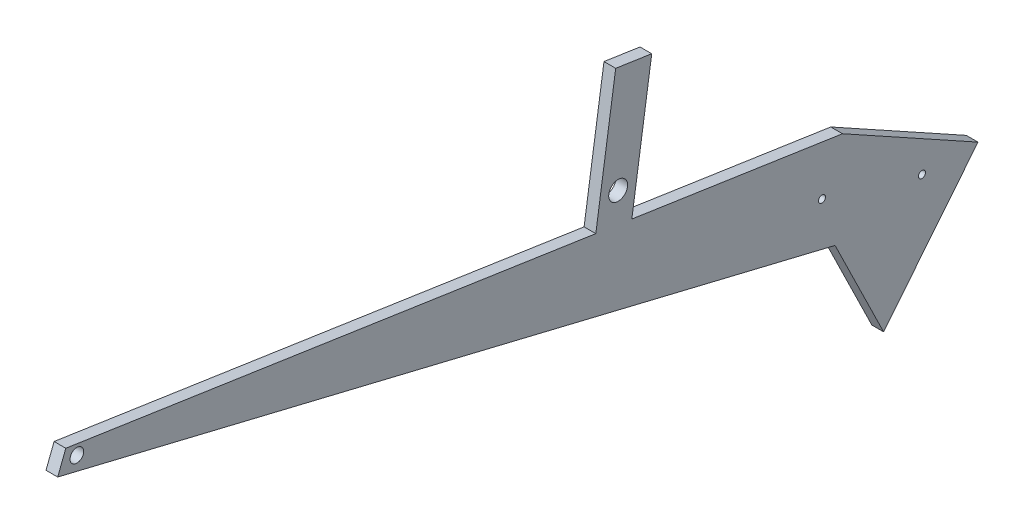
ISO-10303-21;
HEADER;
FILE_DESCRIPTION(('STEP AP214'),'2;1');
FILE_NAME('part.step','',(''),(''),'','','');
FILE_SCHEMA(('AUTOMOTIVE_DESIGN { 1 0 10303 214 1 1 1 1 }'));
ENDSEC;
DATA;
#1=APPLICATION_CONTEXT('core data for automotive mechanical design processes');
#2=APPLICATION_PROTOCOL_DEFINITION('international standard','automotive_design',2000,#1);
#3=PRODUCT_CONTEXT('',#1,'mechanical');
#4=PRODUCT('Part','Part','',(#3));
#5=PRODUCT_RELATED_PRODUCT_CATEGORY('part','',(#4));
#6=PRODUCT_DEFINITION_FORMATION('','',#4);
#7=PRODUCT_DEFINITION_CONTEXT('part definition',#1,'design');
#8=PRODUCT_DEFINITION('design','',#6,#7);
#9=PRODUCT_DEFINITION_SHAPE('','',#8);
#10=(LENGTH_UNIT() NAMED_UNIT(*) SI_UNIT(.MILLI.,.METRE.));
#11=(NAMED_UNIT(*) PLANE_ANGLE_UNIT() SI_UNIT($,.RADIAN.));
#12=(NAMED_UNIT(*) SI_UNIT($,.STERADIAN.) SOLID_ANGLE_UNIT());
#13=UNCERTAINTY_MEASURE_WITH_UNIT(LENGTH_MEASURE(1.E-05),#10,'distance_accuracy_value','');
#14=(GEOMETRIC_REPRESENTATION_CONTEXT(3) GLOBAL_UNCERTAINTY_ASSIGNED_CONTEXT((#13)) GLOBAL_UNIT_ASSIGNED_CONTEXT((#10,
#11,#12)) REPRESENTATION_CONTEXT('',''));
#15=CARTESIAN_POINT('',(0.,0.,0.));
#16=DIRECTION('',(0.,0.,1.));
#17=DIRECTION('',(1.,0.,0.));
#18=AXIS2_PLACEMENT_3D('',#15,#16,#17);
#19=CARTESIAN_POINT('',(2.,8.24424726239253,-1.23091191764888));
#20=DIRECTION('',(0.,0.989036882370752,-0.1476687011873));
#21=DIRECTION('',(0.,0.1476687011873,0.989036882370752));
#22=AXIS2_PLACEMENT_3D('',#19,#20,#21);
#23=PLANE('',#22);
#24=DIRECTION('',(0.,-0.1476687011873,-0.989036882370752));
#25=VECTOR('',#24,1.);
#26=CARTESIAN_POINT('',(0.,8.24424726239253,-1.23091191764888));
#27=LINE('',#26,#25);
#28=CARTESIAN_POINT('',(0.,13.2754290355139,32.4663055395363));
#29=VERTEX_POINT('',#28);
#30=CARTESIAN_POINT('',(0.,7.90579881884249,-3.49772940003051));
#31=VERTEX_POINT('',#30);
#32=EDGE_CURVE('E57',#29,#31,#27,.T.);
#33=ORIENTED_EDGE('',*,*,#32,.F.);
#34=DIRECTION('',(1.,0.,0.));
#35=VECTOR('',#34,1.);
#36=CARTESIAN_POINT('',(0.,13.2754290355139,32.4663055395363));
#37=LINE('',#36,#35);
#38=CARTESIAN_POINT('',(2.,13.2754290355139,32.4663055395363));
#39=VERTEX_POINT('',#38);
#40=EDGE_CURVE('E52',#29,#39,#37,.T.);
#41=ORIENTED_EDGE('',*,*,#40,.T.);
#42=DIRECTION('',(0.,-0.1476687011873,-0.989036882370752));
#43=VECTOR('',#42,1.);
#44=CARTESIAN_POINT('',(2.,8.24424726239253,-1.23091191764888));
#45=LINE('',#44,#43);
#46=CARTESIAN_POINT('',(2.,7.90579881884249,-3.49772940003051));
#47=VERTEX_POINT('',#46);
#48=EDGE_CURVE('E171',#39,#47,#45,.T.);
#49=ORIENTED_EDGE('',*,*,#48,.T.);
#50=DIRECTION('',(-1.,0.,0.));
#51=VECTOR('',#50,1.);
#52=CARTESIAN_POINT('',(2.,7.90579881884249,-3.49772940003051));
#53=LINE('',#52,#51);
#54=EDGE_CURVE('E196',#47,#31,#53,.T.);
#55=ORIENTED_EDGE('',*,*,#54,.T.);
#56=EDGE_LOOP('',(#33,#41,#49,#55));
#57=FACE_BOUND('',#56,.T.);
#58=ADVANCED_FACE('F37',(#57),#23,.T.);
#59=CARTESIAN_POINT('',(2.,47.075809585773,121.612508096581));
#60=DIRECTION('',(0.,0.36099410255771,0.932568098274091));
#61=DIRECTION('',(0.,-0.932568098274091,0.36099410255771));
#62=AXIS2_PLACEMENT_3D('',#59,#60,#61);
#63=PLANE('',#62);
#64=DIRECTION('',(0.,0.932568098274091,-0.36099410255771));
#65=VECTOR('',#64,1.);
#66=CARTESIAN_POINT('',(0.,47.075809585773,121.612508096581));
#67=LINE('',#66,#65);
#68=CARTESIAN_POINT('',(0.,24.1365407268088,130.492225074245));
#69=VERTEX_POINT('',#68);
#70=CARTESIAN_POINT('',(0.,27.7050017136666,129.110885337396));
#71=VERTEX_POINT('',#70);
#72=EDGE_CURVE('E180',#69,#71,#67,.T.);
#73=ORIENTED_EDGE('',*,*,#72,.F.);
#74=DIRECTION('',(-1.,0.,0.));
#75=VECTOR('',#74,1.);
#76=CARTESIAN_POINT('',(2.,24.1365407268088,130.492225074245));
#77=LINE('',#76,#75);
#78=CARTESIAN_POINT('',(2.,24.1365407268088,130.492225074245));
#79=VERTEX_POINT('',#78);
#80=EDGE_CURVE('E11',#79,#69,#77,.T.);
#81=ORIENTED_EDGE('',*,*,#80,.F.);
#82=DIRECTION('',(0.,0.932568098274091,-0.36099410255771));
#83=VECTOR('',#82,1.);
#84=CARTESIAN_POINT('',(2.,47.075809585773,121.612508096581));
#85=LINE('',#84,#83);
#86=CARTESIAN_POINT('',(2.,27.7050017136666,129.110885337396));
#87=VERTEX_POINT('',#86);
#88=EDGE_CURVE('E156',#79,#87,#85,.T.);
#89=ORIENTED_EDGE('',*,*,#88,.T.);
#90=DIRECTION('',(-1.,0.,0.));
#91=VECTOR('',#90,1.);
#92=CARTESIAN_POINT('',(2.,27.7050017136666,129.110885337396));
#93=LINE('',#92,#91);
#94=EDGE_CURVE('E173',#87,#71,#93,.T.);
#95=ORIENTED_EDGE('',*,*,#94,.T.);
#96=EDGE_LOOP('',(#73,#81,#89,#95));
#97=FACE_BOUND('',#96,.T.);
#98=ADVANCED_FACE('F221',(#97),#63,.T.);
#99=CARTESIAN_POINT('',(2.,-7.02811720474141,1.70064588041878));
#100=DIRECTION('',(0.,-0.971949450634516,0.235189849719887));
#101=DIRECTION('',(0.,-0.235189849719887,-0.971949450634516));
#102=AXIS2_PLACEMENT_3D('',#99,#100,#101);
#103=PLANE('',#102);
#104=DIRECTION('',(0.,0.235189849719887,0.971949450634516));
#105=VECTOR('',#104,1.);
#106=CARTESIAN_POINT('',(0.,-7.02811720474141,1.70064588041878));
#107=LINE('',#106,#105);
#108=CARTESIAN_POINT('',(0.,-7.97960815491177,-2.23150130791966));
#109=VERTEX_POINT('',#108);
#110=EDGE_CURVE('E182',#109,#69,#107,.T.);
#111=ORIENTED_EDGE('',*,*,#110,.F.);
#112=DIRECTION('',(-1.,0.,0.));
#113=VECTOR('',#112,1.);
#114=CARTESIAN_POINT('',(2.,-7.97960815491177,-2.23150130791966));
#115=LINE('',#114,#113);
#116=CARTESIAN_POINT('',(2.,-7.97960815491177,-2.23150130791966));
#117=VERTEX_POINT('',#116);
#118=EDGE_CURVE('E45',#117,#109,#115,.T.);
#119=ORIENTED_EDGE('',*,*,#118,.F.);
#120=DIRECTION('',(0.,0.235189849719887,0.971949450634516));
#121=VECTOR('',#120,1.);
#122=CARTESIAN_POINT('',(2.,-7.02811720474141,1.70064588041878));
#123=LINE('',#122,#121);
#124=EDGE_CURVE('E159',#117,#79,#123,.T.);
#125=ORIENTED_EDGE('',*,*,#124,.T.);
#126=ORIENTED_EDGE('',*,*,#80,.T.);
#127=EDGE_LOOP('',(#111,#119,#125,#126));
#128=FACE_BOUND('',#127,.T.);
#129=ADVANCED_FACE('F208',(#128),#103,.T.);
#130=CARTESIAN_POINT('',(2.,-0.662414766246436,1.35243014775314));
#131=DIRECTION('',(0.,-0.439867448810062,0.898062707987214));
#132=DIRECTION('',(0.,-0.898062707987214,-0.439867448810062));
#133=AXIS2_PLACEMENT_3D('',#130,#131,#132);
#134=PLANE('',#133);
#135=DIRECTION('',(0.,0.898062707987214,0.439867448810062));
#136=VECTOR('',#135,1.);
#137=CARTESIAN_POINT('',(0.,-0.662414766246436,1.35243014775314));
#138=LINE('',#137,#136);
#139=CARTESIAN_POINT('',(0.,-24.9010199313022,-10.5195397290088));
#140=VERTEX_POINT('',#139);
#141=EDGE_CURVE('E185',#140,#109,#138,.T.);
#142=ORIENTED_EDGE('',*,*,#141,.F.);
#143=DIRECTION('',(-1.,0.,0.));
#144=VECTOR('',#143,1.);
#145=CARTESIAN_POINT('',(2.,-24.9010199313022,-10.5195397290088));
#146=LINE('',#145,#144);
#147=CARTESIAN_POINT('',(2.,-24.9010199313022,-10.5195397290088));
#148=VERTEX_POINT('',#147);
#149=EDGE_CURVE('E200',#148,#140,#146,.T.);
#150=ORIENTED_EDGE('',*,*,#149,.F.);
#151=DIRECTION('',(0.,0.898062707987214,0.439867448810062));
#152=VECTOR('',#151,1.);
#153=CARTESIAN_POINT('',(2.,-0.662414766246436,1.35243014775314));
#154=LINE('',#153,#152);
#155=EDGE_CURVE('E162',#148,#117,#154,.T.);
#156=ORIENTED_EDGE('',*,*,#155,.T.);
#157=ORIENTED_EDGE('',*,*,#118,.T.);
#158=EDGE_LOOP('',(#142,#150,#156,#157));
#159=FACE_BOUND('',#158,.T.);
#160=ADVANCED_FACE('F204',(#159),#134,.T.);
#161=CARTESIAN_POINT('',(2.,-14.9427884153879,-18.5439305666829));
#162=DIRECTION('',(0.,-0.627447233774446,-0.778659083828601));
#163=DIRECTION('',(0.,0.778659083828601,-0.627447233774446));
#164=AXIS2_PLACEMENT_3D('',#161,#162,#163);
#165=PLANE('',#164);
#166=DIRECTION('',(0.,-0.778659083828601,0.627447233774446));
#167=VECTOR('',#166,1.);
#168=CARTESIAN_POINT('',(0.,-14.9427884153879,-18.5439305666829));
#169=LINE('',#168,#167);
#170=CARTESIAN_POINT('',(0.,-4.90159811442747,-26.6351699922378));
#171=VERTEX_POINT('',#170);
#172=EDGE_CURVE('E188',#171,#140,#169,.T.);
#173=ORIENTED_EDGE('',*,*,#172,.F.);
#174=DIRECTION('',(-1.,0.,0.));
#175=VECTOR('',#174,1.);
#176=CARTESIAN_POINT('',(2.,-4.90159811442747,-26.6351699922378));
#177=LINE('',#176,#175);
#178=CARTESIAN_POINT('',(2.,-4.90159811442747,-26.6351699922378));
#179=VERTEX_POINT('',#178);
#180=EDGE_CURVE('E198',#179,#171,#177,.T.);
#181=ORIENTED_EDGE('',*,*,#180,.F.);
#182=DIRECTION('',(0.,-0.778659083828601,0.627447233774446));
#183=VECTOR('',#182,1.);
#184=CARTESIAN_POINT('',(2.,-14.9427884153879,-18.5439305666829));
#185=LINE('',#184,#183);
#186=EDGE_CURVE('E165',#179,#148,#185,.T.);
#187=ORIENTED_EDGE('',*,*,#186,.T.);
#188=ORIENTED_EDGE('',*,*,#149,.T.);
#189=EDGE_LOOP('',(#173,#181,#187,#188));
#190=FACE_BOUND('',#189,.T.);
#191=ADVANCED_FACE('F213',(#190),#165,.T.);
#192=CARTESIAN_POINT('',(2.,7.53360691846447,-4.17011958429402));
#193=DIRECTION('',(0.,0.874906492091562,-0.484291885226294));
#194=DIRECTION('',(0.,0.484291885226294,0.874906492091562));
#195=AXIS2_PLACEMENT_3D('',#192,#193,#194);
#196=PLANE('',#195);
#197=DIRECTION('',(0.,-0.484291885226294,-0.874906492091562));
#198=VECTOR('',#197,1.);
#199=CARTESIAN_POINT('',(0.,7.53360691846447,-4.17011958429402));
#200=LINE('',#199,#198);
#201=EDGE_CURVE('E191',#31,#171,#200,.T.);
#202=ORIENTED_EDGE('',*,*,#201,.F.);
#203=ORIENTED_EDGE('',*,*,#54,.F.);
#204=DIRECTION('',(0.,-0.484291885226294,-0.874906492091562));
#205=VECTOR('',#204,1.);
#206=CARTESIAN_POINT('',(2.,7.53360691846447,-4.17011958429402));
#207=LINE('',#206,#205);
#208=EDGE_CURVE('E168',#47,#179,#207,.T.);
#209=ORIENTED_EDGE('',*,*,#208,.T.);
#210=ORIENTED_EDGE('',*,*,#180,.T.);
#211=EDGE_LOOP('',(#202,#203,#209,#210));
#212=FACE_BOUND('',#211,.T.);
#213=ADVANCED_FACE('F257',(#212),#196,.T.);
#214=CARTESIAN_POINT('',(2.,0.,0.));
#215=DIRECTION('',(-1.,0.,0.));
#216=DIRECTION('',(0.,0.,1.));
#217=AXIS2_PLACEMENT_3D('',#214,#215,#216);
#218=CYLINDRICAL_SURFACE('',#217,0.600000000000006);
#219=CARTESIAN_POINT('',(2.,0.,0.));
#220=DIRECTION('',(1.,0.,0.));
#221=DIRECTION('',(0.,0.,-1.));
#222=AXIS2_PLACEMENT_3D('',#219,#220,#221);
#223=CIRCLE('',#222,0.600000000000006);
#224=CARTESIAN_POINT('',(2.,0.,-0.600000000000006));
#225=VERTEX_POINT('',#224);
#226=EDGE_CURVE('E153',#225,#225,#223,.T.);
#227=ORIENTED_EDGE('',*,*,#226,.T.);
#228=EDGE_LOOP('',(#227));
#229=FACE_BOUND('',#228,.T.);
#230=CARTESIAN_POINT('',(0.,0.,0.));
#231=DIRECTION('',(1.,0.,0.));
#232=DIRECTION('',(0.,0.,-1.));
#233=AXIS2_PLACEMENT_3D('',#230,#231,#232);
#234=CIRCLE('',#233,0.600000000000006);
#235=CARTESIAN_POINT('',(0.,0.,-0.600000000000006));
#236=VERTEX_POINT('',#235);
#237=EDGE_CURVE('E177',#236,#236,#234,.T.);
#238=ORIENTED_EDGE('',*,*,#237,.F.);
#239=EDGE_LOOP('',(#238));
#240=FACE_BOUND('',#239,.T.);
#241=ADVANCED_FACE('F253',(#229,#240),#218,.F.);
#242=CARTESIAN_POINT('',(2.,-4.90159811442746,-17.0692221077472));
#243=DIRECTION('',(-1.,0.,0.));
#244=DIRECTION('',(0.,0.,1.));
#245=AXIS2_PLACEMENT_3D('',#242,#243,#244);
#246=CYLINDRICAL_SURFACE('',#245,0.599999999999993);
#247=CARTESIAN_POINT('',(2.,-4.90159811442746,-17.0692221077472));
#248=DIRECTION('',(1.,0.,0.));
#249=DIRECTION('',(0.,0.,-1.));
#250=AXIS2_PLACEMENT_3D('',#247,#248,#249);
#251=CIRCLE('',#250,0.599999999999993);
#252=CARTESIAN_POINT('',(2.,-4.90159811442746,-17.6692221077471));
#253=VERTEX_POINT('',#252);
#254=EDGE_CURVE('E150',#253,#253,#251,.T.);
#255=ORIENTED_EDGE('',*,*,#254,.T.);
#256=EDGE_LOOP('',(#255));
#257=FACE_BOUND('',#256,.T.);
#258=CARTESIAN_POINT('',(0.,-4.90159811442746,-17.0692221077472));
#259=DIRECTION('',(1.,0.,0.));
#260=DIRECTION('',(0.,0.,-1.));
#261=AXIS2_PLACEMENT_3D('',#258,#259,#260);
#262=CIRCLE('',#261,0.599999999999993);
#263=CARTESIAN_POINT('',(0.,-4.90159811442746,-17.6692221077471));
#264=VERTEX_POINT('',#263);
#265=EDGE_CURVE('E141',#264,#264,#262,.T.);
#266=ORIENTED_EDGE('',*,*,#265,.F.);
#267=EDGE_LOOP('',(#266));
#268=FACE_BOUND('',#267,.T.);
#269=ADVANCED_FACE('F256',(#257,#268),#246,.F.);
#270=CARTESIAN_POINT('',(2.,25.7178362528132,127.222518318113));
#271=DIRECTION('',(-1.,0.,0.));
#272=DIRECTION('',(0.,0.,1.));
#273=AXIS2_PLACEMENT_3D('',#270,#271,#272);
#274=CYLINDRICAL_SURFACE('',#273,1.16208208034507);
#275=CARTESIAN_POINT('',(2.,25.7178362528132,127.222518318113));
#276=DIRECTION('',(1.,0.,0.));
#277=DIRECTION('',(0.,0.,-1.));
#278=AXIS2_PLACEMENT_3D('',#275,#276,#277);
#279=CIRCLE('',#278,1.16208208034507);
#280=CARTESIAN_POINT('',(2.,25.7178362528132,126.060436237768));
#281=VERTEX_POINT('',#280);
#282=EDGE_CURVE('E147',#281,#281,#279,.T.);
#283=ORIENTED_EDGE('',*,*,#282,.T.);
#284=EDGE_LOOP('',(#283));
#285=FACE_BOUND('',#284,.T.);
#286=CARTESIAN_POINT('',(0.,25.7178362528132,127.222518318113));
#287=DIRECTION('',(1.,0.,0.));
#288=DIRECTION('',(0.,0.,-1.));
#289=AXIS2_PLACEMENT_3D('',#286,#287,#288);
#290=CIRCLE('',#289,1.16208208034507);
#291=CARTESIAN_POINT('',(0.,25.7178362528132,126.060436237768));
#292=VERTEX_POINT('',#291);
#293=EDGE_CURVE('E138',#292,#292,#290,.T.);
#294=ORIENTED_EDGE('',*,*,#293,.F.);
#295=EDGE_LOOP('',(#294));
#296=FACE_BOUND('',#295,.T.);
#297=ADVANCED_FACE('F39',(#285,#296),#274,.F.);
#298=DIRECTION('',(1.,0.,0.));
#299=VECTOR('',#298,1.);
#300=CARTESIAN_POINT('',(0.,14.1942149410919,38.6200343955004));
#301=LINE('',#300,#299);
#302=CARTESIAN_POINT('',(0.,14.1942149410919,38.6200343955004));
#303=VERTEX_POINT('',#302);
#304=CARTESIAN_POINT('',(2.,14.1942149410919,38.6200343955004));
#305=VERTEX_POINT('',#304);
#306=EDGE_CURVE('E224',#303,#305,#301,.T.);
#307=ORIENTED_EDGE('',*,*,#306,.F.);
#308=EDGE_CURVE('E137',#71,#303,#27,.T.);
#309=ORIENTED_EDGE('',*,*,#308,.F.);
#310=ORIENTED_EDGE('',*,*,#94,.F.);
#311=EDGE_CURVE('E172',#87,#305,#45,.T.);
#312=ORIENTED_EDGE('',*,*,#311,.T.);
#313=EDGE_LOOP('',(#307,#309,#310,#312));
#314=FACE_BOUND('',#313,.T.);
#315=ADVANCED_FACE('F223',(#314),#23,.T.);
#316=CARTESIAN_POINT('',(2.,0.,0.));
#317=DIRECTION('',(1.,0.,0.));
#318=DIRECTION('',(0.,0.,-1.));
#319=AXIS2_PLACEMENT_3D('',#316,#317,#318);
#320=PLANE('',#319);
#321=CARTESIAN_POINT('',(2.,18.6800064001567,34.8048264615818));
#322=DIRECTION('',(1.,0.,0.));
#323=DIRECTION('',(0.,0.,-1.));
#324=AXIS2_PLACEMENT_3D('',#321,#322,#323);
#325=CIRCLE('',#324,1.61450875702984);
#326=CARTESIAN_POINT('',(2.,18.6800064001567,33.190317704552));
#327=VERTEX_POINT('',#326);
#328=EDGE_CURVE('E229',#327,#327,#325,.T.);
#329=ORIENTED_EDGE('',*,*,#328,.F.);
#330=EDGE_LOOP('',(#329));
#331=FACE_BOUND('',#330,.T.);
#332=ORIENTED_EDGE('',*,*,#282,.F.);
#333=EDGE_LOOP('',(#332));
#334=FACE_BOUND('',#333,.T.);
#335=ORIENTED_EDGE('',*,*,#254,.F.);
#336=EDGE_LOOP('',(#335));
#337=FACE_BOUND('',#336,.T.);
#338=ORIENTED_EDGE('',*,*,#226,.F.);
#339=EDGE_LOOP('',(#338));
#340=FACE_BOUND('',#339,.T.);
#341=ORIENTED_EDGE('',*,*,#88,.F.);
#342=ORIENTED_EDGE('',*,*,#124,.F.);
#343=ORIENTED_EDGE('',*,*,#155,.F.);
#344=ORIENTED_EDGE('',*,*,#186,.F.);
#345=ORIENTED_EDGE('',*,*,#208,.F.);
#346=ORIENTED_EDGE('',*,*,#48,.F.);
#347=DIRECTION('',(0.,-0.989036882370752,0.1476687011873));
#348=VECTOR('',#347,1.);
#349=CARTESIAN_POINT('',(2.,36.0221079972465,29.070100000111));
#350=LINE('',#349,#348);
#351=CARTESIAN_POINT('',(2.,36.0221079972465,29.070100000111));
#352=VERTEX_POINT('',#351);
#353=EDGE_CURVE('E143',#352,#39,#350,.T.);
#354=ORIENTED_EDGE('',*,*,#353,.F.);
#355=DIRECTION('',(0.,0.147668701187299,0.989036882370752));
#356=VECTOR('',#355,1.);
#357=CARTESIAN_POINT('',(2.,36.0221079972465,29.070100000111));
#358=LINE('',#357,#356);
#359=CARTESIAN_POINT('',(2.,36.9408939028245,35.2238288560751));
#360=VERTEX_POINT('',#359);
#361=EDGE_CURVE('E123',#352,#360,#358,.T.);
#362=ORIENTED_EDGE('',*,*,#361,.T.);
#363=DIRECTION('',(0.,-0.989036882370752,0.1476687011873));
#364=VECTOR('',#363,1.);
#365=CARTESIAN_POINT('',(2.,36.9408939028245,35.2238288560751));
#366=LINE('',#365,#364);
#367=EDGE_CURVE('E119',#360,#305,#366,.T.);
#368=ORIENTED_EDGE('',*,*,#367,.T.);
#369=ORIENTED_EDGE('',*,*,#311,.F.);
#370=EDGE_LOOP('',(#341,#342,#343,#344,#345,#346,#354,#362,#368,#369));
#371=FACE_BOUND('',#370,.T.);
#372=ADVANCED_FACE('F217',(#331,#334,#337,#340,#371),#320,.T.);
#373=CARTESIAN_POINT('',(0.,0.,0.));
#374=DIRECTION('',(1.,0.,0.));
#375=DIRECTION('',(0.,0.,-1.));
#376=AXIS2_PLACEMENT_3D('',#373,#374,#375);
#377=PLANE('',#376);
#378=CARTESIAN_POINT('',(0.,18.6800064001567,34.8048264615818));
#379=DIRECTION('',(1.,0.,0.));
#380=DIRECTION('',(0.,0.,-1.));
#381=AXIS2_PLACEMENT_3D('',#378,#379,#380);
#382=CIRCLE('',#381,1.61450875702984);
#383=CARTESIAN_POINT('',(0.,18.6800064001567,33.190317704552));
#384=VERTEX_POINT('',#383);
#385=EDGE_CURVE('E225',#384,#384,#382,.T.);
#386=ORIENTED_EDGE('',*,*,#385,.T.);
#387=EDGE_LOOP('',(#386));
#388=FACE_BOUND('',#387,.T.);
#389=ORIENTED_EDGE('',*,*,#293,.T.);
#390=EDGE_LOOP('',(#389));
#391=FACE_BOUND('',#390,.T.);
#392=ORIENTED_EDGE('',*,*,#265,.T.);
#393=EDGE_LOOP('',(#392));
#394=FACE_BOUND('',#393,.T.);
#395=ORIENTED_EDGE('',*,*,#237,.T.);
#396=EDGE_LOOP('',(#395));
#397=FACE_BOUND('',#396,.T.);
#398=ORIENTED_EDGE('',*,*,#72,.T.);
#399=ORIENTED_EDGE('',*,*,#308,.T.);
#400=DIRECTION('',(0.,-0.989036882370752,0.1476687011873));
#401=VECTOR('',#400,1.);
#402=CARTESIAN_POINT('',(0.,36.9408939028245,35.2238288560751));
#403=LINE('',#402,#401);
#404=CARTESIAN_POINT('',(0.,36.9408939028245,35.2238288560751));
#405=VERTEX_POINT('',#404);
#406=EDGE_CURVE('E117',#405,#303,#403,.T.);
#407=ORIENTED_EDGE('',*,*,#406,.F.);
#408=DIRECTION('',(0.,0.1476687011873,0.989036882370752));
#409=VECTOR('',#408,1.);
#410=CARTESIAN_POINT('',(0.,36.0221079972465,29.070100000111));
#411=LINE('',#410,#409);
#412=CARTESIAN_POINT('',(0.,36.0221079972465,29.070100000111));
#413=VERTEX_POINT('',#412);
#414=EDGE_CURVE('E124',#413,#405,#411,.T.);
#415=ORIENTED_EDGE('',*,*,#414,.F.);
#416=DIRECTION('',(0.,-0.989036882370752,0.1476687011873));
#417=VECTOR('',#416,1.);
#418=CARTESIAN_POINT('',(0.,36.0221079972465,29.070100000111));
#419=LINE('',#418,#417);
#420=EDGE_CURVE('E234',#413,#29,#419,.T.);
#421=ORIENTED_EDGE('',*,*,#420,.T.);
#422=ORIENTED_EDGE('',*,*,#32,.T.);
#423=ORIENTED_EDGE('',*,*,#201,.T.);
#424=ORIENTED_EDGE('',*,*,#172,.T.);
#425=ORIENTED_EDGE('',*,*,#141,.T.);
#426=ORIENTED_EDGE('',*,*,#110,.T.);
#427=EDGE_LOOP('',(#398,#399,#407,#415,#421,#422,#423,#424,#425,#426));
#428=FACE_BOUND('',#427,.T.);
#429=ADVANCED_FACE('F135',(#388,#391,#394,#397,#428),#377,.F.);
#430=CARTESIAN_POINT('',(0.,36.9408939028245,35.2238288560751));
#431=DIRECTION('',(0.,-0.1476687011873,-0.989036882370752));
#432=DIRECTION('',(0.,0.989036882370752,-0.1476687011873));
#433=AXIS2_PLACEMENT_3D('',#430,#431,#432);
#434=PLANE('',#433);
#435=ORIENTED_EDGE('',*,*,#306,.T.);
#436=ORIENTED_EDGE('',*,*,#367,.F.);
#437=DIRECTION('',(1.,0.,0.));
#438=VECTOR('',#437,1.);
#439=CARTESIAN_POINT('',(0.,36.9408939028245,35.2238288560751));
#440=LINE('',#439,#438);
#441=EDGE_CURVE('E112',#405,#360,#440,.T.);
#442=ORIENTED_EDGE('',*,*,#441,.F.);
#443=ORIENTED_EDGE('',*,*,#406,.T.);
#444=EDGE_LOOP('',(#435,#436,#442,#443));
#445=FACE_BOUND('',#444,.T.);
#446=ADVANCED_FACE('F115',(#445),#434,.F.);
#447=CARTESIAN_POINT('',(0.,36.0221079972465,29.070100000111));
#448=DIRECTION('',(0.,-0.1476687011873,-0.989036882370752));
#449=DIRECTION('',(0.,0.989036882370752,-0.1476687011873));
#450=AXIS2_PLACEMENT_3D('',#447,#448,#449);
#451=PLANE('',#450);
#452=ORIENTED_EDGE('',*,*,#40,.F.);
#453=ORIENTED_EDGE('',*,*,#420,.F.);
#454=DIRECTION('',(1.,0.,0.));
#455=VECTOR('',#454,1.);
#456=CARTESIAN_POINT('',(0.,36.0221079972465,29.070100000111));
#457=LINE('',#456,#455);
#458=EDGE_CURVE('E130',#413,#352,#457,.T.);
#459=ORIENTED_EDGE('',*,*,#458,.T.);
#460=ORIENTED_EDGE('',*,*,#353,.T.);
#461=EDGE_LOOP('',(#452,#453,#459,#460));
#462=FACE_BOUND('',#461,.T.);
#463=ADVANCED_FACE('F237',(#462),#451,.T.);
#464=CARTESIAN_POINT('',(0.,30.9909262241251,-4.62711745707423));
#465=DIRECTION('',(0.,0.989036882370752,-0.1476687011873));
#466=DIRECTION('',(0.,0.1476687011873,0.989036882370752));
#467=AXIS2_PLACEMENT_3D('',#464,#465,#466);
#468=PLANE('',#467);
#469=ORIENTED_EDGE('',*,*,#414,.T.);
#470=ORIENTED_EDGE('',*,*,#441,.T.);
#471=ORIENTED_EDGE('',*,*,#361,.F.);
#472=ORIENTED_EDGE('',*,*,#458,.F.);
#473=EDGE_LOOP('',(#469,#470,#471,#472));
#474=FACE_BOUND('',#473,.T.);
#475=ADVANCED_FACE('F128',(#474),#468,.T.);
#476=CARTESIAN_POINT('',(0.,18.6800064001567,34.8048264615818));
#477=DIRECTION('',(1.,0.,0.));
#478=DIRECTION('',(0.,0.,-1.));
#479=AXIS2_PLACEMENT_3D('',#476,#477,#478);
#480=CYLINDRICAL_SURFACE('',#479,1.61450875702984);
#481=ORIENTED_EDGE('',*,*,#385,.F.);
#482=EDGE_LOOP('',(#481));
#483=FACE_BOUND('',#482,.T.);
#484=ORIENTED_EDGE('',*,*,#328,.T.);
#485=EDGE_LOOP('',(#484));
#486=FACE_BOUND('',#485,.T.);
#487=ADVANCED_FACE('F242',(#483,#486),#480,.F.);
#488=CLOSED_SHELL('',(#58,#98,#129,#160,#191,#213,#241,#269,#297,#315,#372,#429,#446,#463,#475,#487));
#489=MANIFOLD_SOLID_BREP('B2',#488);
#490=ADVANCED_BREP_SHAPE_REPRESENTATION('',(#18,#489),#14);
#491=SHAPE_DEFINITION_REPRESENTATION(#9,#490);
ENDSEC;
END-ISO-10303-21;
